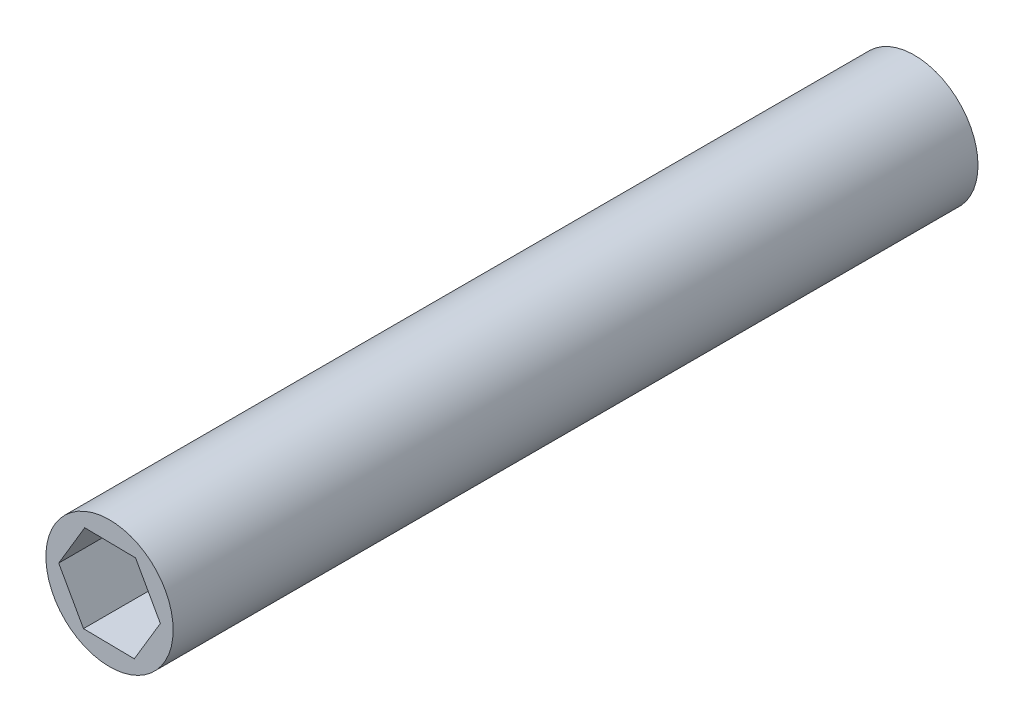
ISO-10303-21;
HEADER;
FILE_DESCRIPTION(('STEP AP214'),'2;1');
FILE_NAME('part.step','',(''),(''),'','','');
FILE_SCHEMA(('AUTOMOTIVE_DESIGN { 1 0 10303 214 1 1 1 1 }'));
ENDSEC;
DATA;
#1=APPLICATION_CONTEXT('core data for automotive mechanical design processes');
#2=APPLICATION_PROTOCOL_DEFINITION('international standard','automotive_design',2000,#1);
#3=PRODUCT_CONTEXT('',#1,'mechanical');
#4=PRODUCT('Part','Part','',(#3));
#5=PRODUCT_RELATED_PRODUCT_CATEGORY('part','',(#4));
#6=PRODUCT_DEFINITION_FORMATION('','',#4);
#7=PRODUCT_DEFINITION_CONTEXT('part definition',#1,'design');
#8=PRODUCT_DEFINITION('design','',#6,#7);
#9=PRODUCT_DEFINITION_SHAPE('','',#8);
#10=(LENGTH_UNIT() NAMED_UNIT(*) SI_UNIT(.MILLI.,.METRE.));
#11=(NAMED_UNIT(*) PLANE_ANGLE_UNIT() SI_UNIT($,.RADIAN.));
#12=(NAMED_UNIT(*) SI_UNIT($,.STERADIAN.) SOLID_ANGLE_UNIT());
#13=UNCERTAINTY_MEASURE_WITH_UNIT(LENGTH_MEASURE(1.E-05),#10,'distance_accuracy_value','');
#14=(GEOMETRIC_REPRESENTATION_CONTEXT(3) GLOBAL_UNCERTAINTY_ASSIGNED_CONTEXT((#13)) GLOBAL_UNIT_ASSIGNED_CONTEXT((#10,
#11,#12)) REPRESENTATION_CONTEXT('',''));
#15=CARTESIAN_POINT('',(0.,0.,0.));
#16=DIRECTION('',(0.,0.,1.));
#17=DIRECTION('',(1.,0.,0.));
#18=AXIS2_PLACEMENT_3D('',#15,#16,#17);
#19=CARTESIAN_POINT('',(0.,0.,-203.));
#20=DIRECTION('',(0.,0.,1.));
#21=DIRECTION('',(1.,0.,0.));
#22=AXIS2_PLACEMENT_3D('',#19,#20,#21);
#23=CYLINDRICAL_SURFACE('',#22,16.0527026682593);
#24=CARTESIAN_POINT('',(0.,0.,-203.));
#25=DIRECTION('',(0.,0.,1.));
#26=DIRECTION('',(1.,0.,0.));
#27=AXIS2_PLACEMENT_3D('',#24,#25,#26);
#28=CIRCLE('',#27,16.0527026682593);
#29=CARTESIAN_POINT('',(16.0527026682593,0.,-203.));
#30=VERTEX_POINT('',#29);
#31=EDGE_CURVE('E11',#30,#30,#28,.T.);
#32=CARTESIAN_POINT('',(0.,0.,0.));
#33=DIRECTION('',(0.,0.,1.));
#34=DIRECTION('',(1.,0.,0.));
#35=AXIS2_PLACEMENT_3D('',#32,#33,#34);
#36=CIRCLE('',#35,16.0527026682593);
#37=CARTESIAN_POINT('',(16.0527026682593,0.,0.));
#38=VERTEX_POINT('',#37);
#39=EDGE_CURVE('E36',#38,#38,#36,.T.);
#40=CARTESIAN_POINT('',(16.0527026682593,0.,-203.));
#41=CARTESIAN_POINT('',(16.0527026682593,0.,-200.885416666667));
#42=CARTESIAN_POINT('',(16.0527026682593,0.,-198.770833333333));
#43=CARTESIAN_POINT('',(16.0527026682593,0.,-194.541666666667));
#44=CARTESIAN_POINT('',(16.0527026682593,0.,-192.427083333333));
#45=CARTESIAN_POINT('',(16.0527026682593,0.,-188.197916666667));
#46=CARTESIAN_POINT('',(16.0527026682593,0.,-186.083333333333));
#47=CARTESIAN_POINT('',(16.0527026682593,0.,-181.854166666667));
#48=CARTESIAN_POINT('',(16.0527026682593,0.,-179.739583333333));
#49=CARTESIAN_POINT('',(16.0527026682593,0.,-175.510416666667));
#50=CARTESIAN_POINT('',(16.0527026682593,0.,-173.395833333333));
#51=CARTESIAN_POINT('',(16.0527026682593,0.,-169.166666666667));
#52=CARTESIAN_POINT('',(16.0527026682593,0.,-167.052083333333));
#53=CARTESIAN_POINT('',(16.0527026682593,0.,-162.822916666667));
#54=CARTESIAN_POINT('',(16.0527026682593,0.,-160.708333333333));
#55=CARTESIAN_POINT('',(16.0527026682593,0.,-156.479166666667));
#56=CARTESIAN_POINT('',(16.0527026682593,0.,-154.364583333333));
#57=CARTESIAN_POINT('',(16.0527026682593,0.,-150.135416666667));
#58=CARTESIAN_POINT('',(16.0527026682593,0.,-148.020833333333));
#59=CARTESIAN_POINT('',(16.0527026682593,0.,-143.791666666667));
#60=CARTESIAN_POINT('',(16.0527026682593,0.,-141.677083333333));
#61=CARTESIAN_POINT('',(16.0527026682593,0.,-137.447916666667));
#62=CARTESIAN_POINT('',(16.0527026682593,0.,-135.333333333333));
#63=CARTESIAN_POINT('',(16.0527026682593,0.,-131.104166666667));
#64=CARTESIAN_POINT('',(16.0527026682593,0.,-128.989583333333));
#65=CARTESIAN_POINT('',(16.0527026682593,0.,-124.760416666667));
#66=CARTESIAN_POINT('',(16.0527026682593,0.,-122.645833333333));
#67=CARTESIAN_POINT('',(16.0527026682593,0.,-118.416666666667));
#68=CARTESIAN_POINT('',(16.0527026682593,0.,-116.302083333333));
#69=CARTESIAN_POINT('',(16.0527026682593,0.,-112.072916666667));
#70=CARTESIAN_POINT('',(16.0527026682593,0.,-109.958333333333));
#71=CARTESIAN_POINT('',(16.0527026682593,0.,-105.729166666667));
#72=CARTESIAN_POINT('',(16.0527026682593,0.,-103.614583333333));
#73=CARTESIAN_POINT('',(16.0527026682593,0.,-99.3854166666667));
#74=CARTESIAN_POINT('',(16.0527026682593,0.,-97.2708333333334));
#75=CARTESIAN_POINT('',(16.0527026682593,0.,-93.0416666666667));
#76=CARTESIAN_POINT('',(16.0527026682593,0.,-90.9270833333334));
#77=CARTESIAN_POINT('',(16.0527026682593,0.,-86.6979166666667));
#78=CARTESIAN_POINT('',(16.0527026682593,0.,-84.5833333333334));
#79=CARTESIAN_POINT('',(16.0527026682593,0.,-80.3541666666667));
#80=CARTESIAN_POINT('',(16.0527026682593,0.,-78.2395833333334));
#81=CARTESIAN_POINT('',(16.0527026682593,0.,-74.0104166666667));
#82=CARTESIAN_POINT('',(16.0527026682593,0.,-71.8958333333334));
#83=CARTESIAN_POINT('',(16.0527026682593,0.,-67.6666666666667));
#84=CARTESIAN_POINT('',(16.0527026682593,0.,-65.5520833333334));
#85=CARTESIAN_POINT('',(16.0527026682593,0.,-61.3229166666667));
#86=CARTESIAN_POINT('',(16.0527026682593,0.,-59.2083333333334));
#87=CARTESIAN_POINT('',(16.0527026682593,0.,-54.9791666666667));
#88=CARTESIAN_POINT('',(16.0527026682593,0.,-52.8645833333334));
#89=CARTESIAN_POINT('',(16.0527026682593,0.,-48.6354166666667));
#90=CARTESIAN_POINT('',(16.0527026682593,0.,-46.5208333333334));
#91=CARTESIAN_POINT('',(16.0527026682593,0.,-42.2916666666667));
#92=CARTESIAN_POINT('',(16.0527026682593,0.,-40.1770833333334));
#93=CARTESIAN_POINT('',(16.0527026682593,0.,-35.9479166666667));
#94=CARTESIAN_POINT('',(16.0527026682593,0.,-33.8333333333334));
#95=CARTESIAN_POINT('',(16.0527026682593,0.,-29.6041666666667));
#96=CARTESIAN_POINT('',(16.0527026682593,0.,-27.4895833333334));
#97=CARTESIAN_POINT('',(16.0527026682593,0.,-23.2604166666667));
#98=CARTESIAN_POINT('',(16.0527026682593,0.,-21.1458333333334));
#99=CARTESIAN_POINT('',(16.0527026682593,0.,-16.9166666666667));
#100=CARTESIAN_POINT('',(16.0527026682593,0.,-14.8020833333334));
#101=CARTESIAN_POINT('',(16.0527026682593,0.,-10.5729166666667));
#102=CARTESIAN_POINT('',(16.0527026682593,0.,-8.45833333333336));
#103=CARTESIAN_POINT('',(16.0527026682593,0.,-4.2291666666667));
#104=CARTESIAN_POINT('',(16.0527026682593,0.,-2.11458333333337));
#105=CARTESIAN_POINT('',(16.0527026682593,0.,0.));
#106=B_SPLINE_CURVE_WITH_KNOTS('',3,(#40,#41,#42,#43,#44,#45,#46,#47,#48,#49,#50,#51,#52,#53,
#54,#55,#56,#57,#58,#59,#60,#61,#62,#63,#64,#65,#66,#67,#68,#69,#70,#71,#72,#73,#74,#75,#76,#77,
#78,#79,#80,#81,#82,#83,#84,#85,#86,#87,#88,#89,#90,#91,#92,#93,#94,#95,#96,#97,#98,#99,#100,
#101,#102,#103,#104,#105),.UNSPECIFIED.,.F.,.F.,(4,2,2,2,2,2,2,2,2,2,2,2,2,2,2,2,2,2,2,2,2,2,2,
2,2,2,2,2,2,2,2,2,4),(0.,6.34375000000001,12.6875,19.03125,25.375,31.71875,38.0625,44.40625,
50.75,57.09375,63.4375,69.78125,76.125,82.46875,88.8125,95.15625,101.5,107.84375,114.1875,
120.53125,126.875,133.21875,139.5625,145.90625,152.25,158.59375,164.9375,171.28125,177.625,
183.96875,190.3125,196.65625,203.),.UNSPECIFIED.);
#107=EDGE_CURVE('BSEAM33',#30,#38,#106,.T.);
#108=ORIENTED_EDGE('',*,*,#31,.T.);
#109=ORIENTED_EDGE('',*,*,#39,.F.);
#110=ORIENTED_EDGE('',*,*,#107,.T.);
#111=ORIENTED_EDGE('',*,*,#107,.F.);
#112=EDGE_LOOP('',(#108,#110,#109,#111));
#113=FACE_BOUND('',#112,.T.);
#114=ADVANCED_FACE('F33',(#113),#23,.T.);
#115=CARTESIAN_POINT('',(0.,0.,-203.));
#116=DIRECTION('',(0.,0.,1.));
#117=DIRECTION('',(1.,0.,0.));
#118=AXIS2_PLACEMENT_3D('',#115,#116,#117);
#119=PLANE('',#118);
#120=DIRECTION('',(0.999896742561013,-0.0143702545515204,0.));
#121=VECTOR('',#120,1.);
#122=CARTESIAN_POINT('',(-0.159537254612559,-11.1007623861017,-203.));
#123=LINE('',#122,#121);
#124=CARTESIAN_POINT('',(-6.56856540643846,-11.0086535092054,-203.));
#125=VERTEX_POINT('',#124);
#126=CARTESIAN_POINT('',(6.24949089721334,-11.1928712629981,-203.));
#127=VERTEX_POINT('',#126);
#128=EDGE_CURVE('E133',#125,#127,#123,.T.);
#129=ORIENTED_EDGE('',*,*,#128,.T.);
#130=DIRECTION('',(0.512393376780972,0.858750852943386,0.));
#131=VECTOR('',#130,1.);
#132=CARTESIAN_POINT('',(9.53377360043257,-5.68854450839536,-203.));
#133=LINE('',#132,#131);
#134=CARTESIAN_POINT('',(12.8180563036518,-0.184217753792663,-203.));
#135=VERTEX_POINT('',#134);
#136=EDGE_CURVE('E136',#127,#135,#133,.T.);
#137=ORIENTED_EDGE('',*,*,#136,.T.);
#138=DIRECTION('',(-0.487503365780041,0.873121107494906,0.));
#139=VECTOR('',#138,1.);
#140=CARTESIAN_POINT('',(9.69331085504513,5.41221787770636,-203.));
#141=LINE('',#140,#139);
#142=CARTESIAN_POINT('',(6.56856540643845,11.0086535092054,-203.));
#143=VERTEX_POINT('',#142);
#144=EDGE_CURVE('E118',#135,#143,#141,.T.);
#145=ORIENTED_EDGE('',*,*,#144,.T.);
#146=DIRECTION('',(-0.999896742561013,0.01437025455152,0.));
#147=VECTOR('',#146,1.);
#148=CARTESIAN_POINT('',(0.159537254612554,11.1007623861017,-203.));
#149=LINE('',#148,#147);
#150=CARTESIAN_POINT('',(-6.24949089721334,11.1928712629981,-203.));
#151=VERTEX_POINT('',#150);
#152=EDGE_CURVE('E91',#143,#151,#149,.T.);
#153=ORIENTED_EDGE('',*,*,#152,.T.);
#154=DIRECTION('',(-0.512393376780972,-0.858750852943386,0.));
#155=VECTOR('',#154,1.);
#156=CARTESIAN_POINT('',(-9.53377360043257,5.68854450839536,-203.));
#157=LINE('',#156,#155);
#158=CARTESIAN_POINT('',(-12.8180563036518,0.184217753792668,-203.));
#159=VERTEX_POINT('',#158);
#160=EDGE_CURVE('E127',#151,#159,#157,.T.);
#161=ORIENTED_EDGE('',*,*,#160,.T.);
#162=DIRECTION('',(0.487503365780041,-0.873121107494906,0.));
#163=VECTOR('',#162,1.);
#164=CARTESIAN_POINT('',(-9.69331085504513,-5.41221787770636,-203.));
#165=LINE('',#164,#163);
#166=EDGE_CURVE('E130',#159,#125,#165,.T.);
#167=ORIENTED_EDGE('',*,*,#166,.T.);
#168=EDGE_LOOP('',(#129,#137,#145,#153,#161,#167));
#169=FACE_BOUND('',#168,.T.);
#170=ORIENTED_EDGE('',*,*,#31,.F.);
#171=EDGE_LOOP('',(#170));
#172=FACE_BOUND('',#171,.T.);
#173=ADVANCED_FACE('F143',(#169,#172),#119,.F.);
#174=CARTESIAN_POINT('',(0.,0.,0.));
#175=DIRECTION('',(0.,0.,1.));
#176=DIRECTION('',(1.,0.,0.));
#177=AXIS2_PLACEMENT_3D('',#174,#175,#176);
#178=PLANE('',#177);
#179=DIRECTION('',(0.512393376780972,0.858750852943386,0.));
#180=VECTOR('',#179,1.);
#181=CARTESIAN_POINT('',(6.24949089721334,-11.1928712629981,0.));
#182=LINE('',#181,#180);
#183=CARTESIAN_POINT('',(6.24949089721334,-11.1928712629981,0.));
#184=VERTEX_POINT('',#183);
#185=CARTESIAN_POINT('',(12.8180563036518,-0.184217753792663,0.));
#186=VERTEX_POINT('',#185);
#187=EDGE_CURVE('E55',#184,#186,#182,.T.);
#188=ORIENTED_EDGE('',*,*,#187,.F.);
#189=DIRECTION('',(0.999896742561013,-0.0143702545515204,0.));
#190=VECTOR('',#189,1.);
#191=CARTESIAN_POINT('',(-6.56856540643846,-11.0086535092054,0.));
#192=LINE('',#191,#190);
#193=CARTESIAN_POINT('',(-6.56856540643846,-11.0086535092054,0.));
#194=VERTEX_POINT('',#193);
#195=EDGE_CURVE('E113',#194,#184,#192,.T.);
#196=ORIENTED_EDGE('',*,*,#195,.F.);
#197=DIRECTION('',(0.487503365780041,-0.873121107494906,0.));
#198=VECTOR('',#197,1.);
#199=CARTESIAN_POINT('',(-12.8180563036518,0.184217753792668,0.));
#200=LINE('',#199,#198);
#201=CARTESIAN_POINT('',(-12.8180563036518,0.184217753792668,0.));
#202=VERTEX_POINT('',#201);
#203=EDGE_CURVE('E107',#202,#194,#200,.T.);
#204=ORIENTED_EDGE('',*,*,#203,.F.);
#205=DIRECTION('',(-0.512393376780972,-0.858750852943386,0.));
#206=VECTOR('',#205,1.);
#207=CARTESIAN_POINT('',(-6.24949089721334,11.1928712629981,0.));
#208=LINE('',#207,#206);
#209=CARTESIAN_POINT('',(-6.24949089721334,11.1928712629981,0.));
#210=VERTEX_POINT('',#209);
#211=EDGE_CURVE('E105',#210,#202,#208,.T.);
#212=ORIENTED_EDGE('',*,*,#211,.F.);
#213=DIRECTION('',(-0.999896742561013,0.01437025455152,0.));
#214=VECTOR('',#213,1.);
#215=CARTESIAN_POINT('',(6.56856540643846,11.0086535092054,0.));
#216=LINE('',#215,#214);
#217=CARTESIAN_POINT('',(6.56856540643846,11.0086535092054,0.));
#218=VERTEX_POINT('',#217);
#219=EDGE_CURVE('E88',#218,#210,#216,.T.);
#220=ORIENTED_EDGE('',*,*,#219,.F.);
#221=DIRECTION('',(-0.487503365780041,0.873121107494906,0.));
#222=VECTOR('',#221,1.);
#223=CARTESIAN_POINT('',(12.8180563036518,-0.184217753792663,0.));
#224=LINE('',#223,#222);
#225=EDGE_CURVE('E97',#186,#218,#224,.T.);
#226=ORIENTED_EDGE('',*,*,#225,.F.);
#227=EDGE_LOOP('',(#188,#196,#204,#212,#220,#226));
#228=FACE_BOUND('',#227,.T.);
#229=ORIENTED_EDGE('',*,*,#39,.T.);
#230=EDGE_LOOP('',(#229));
#231=FACE_BOUND('',#230,.T.);
#232=ADVANCED_FACE('F101',(#228,#231),#178,.T.);
#233=CARTESIAN_POINT('',(6.24949089721334,-11.1928712629981,-476.));
#234=DIRECTION('',(0.858750852943386,-0.512393376780972,0.));
#235=DIRECTION('',(0.512393376780972,0.858750852943386,0.));
#236=AXIS2_PLACEMENT_3D('',#233,#234,#235);
#237=PLANE('',#236);
#238=DIRECTION('',(0.,0.,1.));
#239=VECTOR('',#238,1.);
#240=CARTESIAN_POINT('',(6.24949089721334,-11.1928712629981,-476.));
#241=LINE('',#240,#239);
#242=EDGE_CURVE('E116',#127,#184,#241,.T.);
#243=ORIENTED_EDGE('',*,*,#242,.T.);
#244=ORIENTED_EDGE('',*,*,#187,.T.);
#245=DIRECTION('',(0.,0.,1.));
#246=VECTOR('',#245,1.);
#247=CARTESIAN_POINT('',(12.8180563036518,-0.184217753792663,-476.));
#248=LINE('',#247,#246);
#249=EDGE_CURVE('E94',#135,#186,#248,.T.);
#250=ORIENTED_EDGE('',*,*,#249,.F.);
#251=ORIENTED_EDGE('',*,*,#136,.F.);
#252=EDGE_LOOP('',(#243,#244,#250,#251));
#253=FACE_BOUND('',#252,.T.);
#254=ADVANCED_FACE('F154',(#253),#237,.F.);
#255=CARTESIAN_POINT('',(-6.56856540643846,-11.0086535092054,-476.));
#256=DIRECTION('',(-0.0143702545515204,-0.999896742561013,0.));
#257=DIRECTION('',(0.999896742561013,-0.0143702545515204,0.));
#258=AXIS2_PLACEMENT_3D('',#255,#256,#257);
#259=PLANE('',#258);
#260=DIRECTION('',(0.,0.,1.));
#261=VECTOR('',#260,1.);
#262=CARTESIAN_POINT('',(-6.56856540643846,-11.0086535092054,-476.));
#263=LINE('',#262,#261);
#264=EDGE_CURVE('E119',#125,#194,#263,.T.);
#265=ORIENTED_EDGE('',*,*,#264,.T.);
#266=ORIENTED_EDGE('',*,*,#195,.T.);
#267=ORIENTED_EDGE('',*,*,#242,.F.);
#268=ORIENTED_EDGE('',*,*,#128,.F.);
#269=EDGE_LOOP('',(#265,#266,#267,#268));
#270=FACE_BOUND('',#269,.T.);
#271=ADVANCED_FACE('F158',(#270),#259,.F.);
#272=CARTESIAN_POINT('',(-12.8180563036518,0.184217753792668,-476.));
#273=DIRECTION('',(-0.873121107494906,-0.487503365780041,0.));
#274=DIRECTION('',(0.487503365780041,-0.873121107494906,0.));
#275=AXIS2_PLACEMENT_3D('',#272,#273,#274);
#276=PLANE('',#275);
#277=DIRECTION('',(0.,0.,1.));
#278=VECTOR('',#277,1.);
#279=CARTESIAN_POINT('',(-12.8180563036518,0.184217753792668,-476.));
#280=LINE('',#279,#278);
#281=EDGE_CURVE('E121',#159,#202,#280,.T.);
#282=ORIENTED_EDGE('',*,*,#281,.T.);
#283=ORIENTED_EDGE('',*,*,#203,.T.);
#284=ORIENTED_EDGE('',*,*,#264,.F.);
#285=ORIENTED_EDGE('',*,*,#166,.F.);
#286=EDGE_LOOP('',(#282,#283,#284,#285));
#287=FACE_BOUND('',#286,.T.);
#288=ADVANCED_FACE('F166',(#287),#276,.F.);
#289=CARTESIAN_POINT('',(-6.24949089721334,11.1928712629981,-476.));
#290=DIRECTION('',(-0.858750852943386,0.512393376780972,0.));
#291=DIRECTION('',(-0.512393376780972,-0.858750852943386,0.));
#292=AXIS2_PLACEMENT_3D('',#289,#290,#291);
#293=PLANE('',#292);
#294=DIRECTION('',(0.,0.,1.));
#295=VECTOR('',#294,1.);
#296=CARTESIAN_POINT('',(-6.24949089721334,11.1928712629981,-476.));
#297=LINE('',#296,#295);
#298=EDGE_CURVE('E93',#151,#210,#297,.T.);
#299=ORIENTED_EDGE('',*,*,#298,.T.);
#300=ORIENTED_EDGE('',*,*,#211,.T.);
#301=ORIENTED_EDGE('',*,*,#281,.F.);
#302=ORIENTED_EDGE('',*,*,#160,.F.);
#303=EDGE_LOOP('',(#299,#300,#301,#302));
#304=FACE_BOUND('',#303,.T.);
#305=ADVANCED_FACE('F163',(#304),#293,.F.);
#306=CARTESIAN_POINT('',(6.56856540643846,11.0086535092054,-476.));
#307=DIRECTION('',(0.01437025455152,0.999896742561013,0.));
#308=DIRECTION('',(-0.999896742561013,0.01437025455152,0.));
#309=AXIS2_PLACEMENT_3D('',#306,#307,#308);
#310=PLANE('',#309);
#311=DIRECTION('',(0.,0.,1.));
#312=VECTOR('',#311,1.);
#313=CARTESIAN_POINT('',(6.56856540643846,11.0086535092054,-476.));
#314=LINE('',#313,#312);
#315=EDGE_CURVE('E47',#143,#218,#314,.T.);
#316=ORIENTED_EDGE('',*,*,#315,.T.);
#317=ORIENTED_EDGE('',*,*,#219,.T.);
#318=ORIENTED_EDGE('',*,*,#298,.F.);
#319=ORIENTED_EDGE('',*,*,#152,.F.);
#320=EDGE_LOOP('',(#316,#317,#318,#319));
#321=FACE_BOUND('',#320,.T.);
#322=ADVANCED_FACE('F85',(#321),#310,.F.);
#323=CARTESIAN_POINT('',(12.8180563036518,-0.184217753792663,-476.));
#324=DIRECTION('',(0.873121107494906,0.487503365780041,0.));
#325=DIRECTION('',(-0.487503365780041,0.873121107494906,0.));
#326=AXIS2_PLACEMENT_3D('',#323,#324,#325);
#327=PLANE('',#326);
#328=ORIENTED_EDGE('',*,*,#249,.T.);
#329=ORIENTED_EDGE('',*,*,#225,.T.);
#330=ORIENTED_EDGE('',*,*,#315,.F.);
#331=ORIENTED_EDGE('',*,*,#144,.F.);
#332=EDGE_LOOP('',(#328,#329,#330,#331));
#333=FACE_BOUND('',#332,.T.);
#334=ADVANCED_FACE('F98',(#333),#327,.F.);
#335=CLOSED_SHELL('',(#114,#173,#232,#254,#271,#288,#305,#322,#334));
#336=MANIFOLD_SOLID_BREP('B2',#335);
#337=ADVANCED_BREP_SHAPE_REPRESENTATION('',(#18,#336),#14);
#338=SHAPE_DEFINITION_REPRESENTATION(#9,#337);
ENDSEC;
END-ISO-10303-21;
